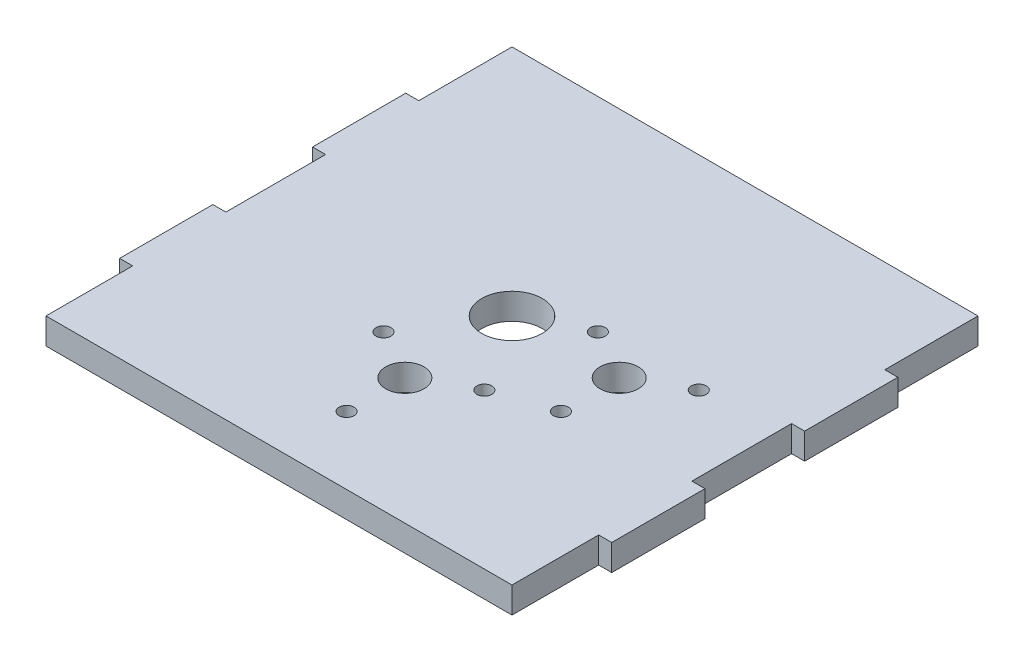
ISO-10303-21;
HEADER;
FILE_DESCRIPTION(('STEP AP214'),'2;1');
FILE_NAME('part.step','',(''),(''),'','','');
FILE_SCHEMA(('AUTOMOTIVE_DESIGN { 1 0 10303 214 1 1 1 1 }'));
ENDSEC;
DATA;
#1=APPLICATION_CONTEXT('core data for automotive mechanical design processes');
#2=APPLICATION_PROTOCOL_DEFINITION('international standard','automotive_design',2000,#1);
#3=PRODUCT_CONTEXT('',#1,'mechanical');
#4=PRODUCT('Part','Part','',(#3));
#5=PRODUCT_RELATED_PRODUCT_CATEGORY('part','',(#4));
#6=PRODUCT_DEFINITION_FORMATION('','',#4);
#7=PRODUCT_DEFINITION_CONTEXT('part definition',#1,'design');
#8=PRODUCT_DEFINITION('design','',#6,#7);
#9=PRODUCT_DEFINITION_SHAPE('','',#8);
#10=(LENGTH_UNIT() NAMED_UNIT(*) SI_UNIT(.MILLI.,.METRE.));
#11=(NAMED_UNIT(*) PLANE_ANGLE_UNIT() SI_UNIT($,.RADIAN.));
#12=(NAMED_UNIT(*) SI_UNIT($,.STERADIAN.) SOLID_ANGLE_UNIT());
#13=UNCERTAINTY_MEASURE_WITH_UNIT(LENGTH_MEASURE(1.E-05),#10,'distance_accuracy_value','');
#14=(GEOMETRIC_REPRESENTATION_CONTEXT(3) GLOBAL_UNCERTAINTY_ASSIGNED_CONTEXT((#13)) GLOBAL_UNIT_ASSIGNED_CONTEXT((#10,
#11,#12)) REPRESENTATION_CONTEXT('',''));
#15=CARTESIAN_POINT('',(0.,0.,0.));
#16=DIRECTION('',(0.,0.,1.));
#17=DIRECTION('',(1.,0.,0.));
#18=AXIS2_PLACEMENT_3D('',#15,#16,#17);
#19=CARTESIAN_POINT('',(222.2,5.59999999999876,105.6));
#20=DIRECTION('',(0.,0.,1.));
#21=DIRECTION('',(0.,-1.,0.));
#22=AXIS2_PLACEMENT_3D('',#19,#20,#21);
#23=PLANE('',#22);
#24=DIRECTION('',(-1.,0.,0.));
#25=VECTOR('',#24,1.);
#26=CARTESIAN_POINT('',(222.2,-1.23669084790829E-12,105.6));
#27=LINE('',#26,#25);
#28=CARTESIAN_POINT('',(222.2,-1.23669084790829E-12,105.6));
#29=VERTEX_POINT('',#28);
#30=CARTESIAN_POINT('',(122.2,-6.81579335595712E-13,105.6));
#31=VERTEX_POINT('',#30);
#32=EDGE_CURVE('E203',#29,#31,#27,.T.);
#33=ORIENTED_EDGE('',*,*,#32,.F.);
#34=DIRECTION('',(0.,-1.,0.));
#35=VECTOR('',#34,1.);
#36=CARTESIAN_POINT('',(222.2,5.59999999999876,105.6));
#37=LINE('',#36,#35);
#38=CARTESIAN_POINT('',(222.2,5.59999999999876,105.6));
#39=VERTEX_POINT('',#38);
#40=EDGE_CURVE('E11',#39,#29,#37,.T.);
#41=ORIENTED_EDGE('',*,*,#40,.F.);
#42=DIRECTION('',(-1.,0.,0.));
#43=VECTOR('',#42,1.);
#44=CARTESIAN_POINT('',(222.2,5.59999999999876,105.6));
#45=LINE('',#44,#43);
#46=CARTESIAN_POINT('',(122.2,5.59999999999932,105.6));
#47=VERTEX_POINT('',#46);
#48=EDGE_CURVE('E260',#39,#47,#45,.T.);
#49=ORIENTED_EDGE('',*,*,#48,.T.);
#50=DIRECTION('',(0.,-1.,0.));
#51=VECTOR('',#50,1.);
#52=CARTESIAN_POINT('',(122.2,5.59999999999932,105.6));
#53=LINE('',#52,#51);
#54=EDGE_CURVE('E37',#47,#31,#53,.T.);
#55=ORIENTED_EDGE('',*,*,#54,.T.);
#56=EDGE_LOOP('',(#33,#41,#49,#55));
#57=FACE_BOUND('',#56,.T.);
#58=ADVANCED_FACE('F34',(#57),#23,.T.);
#59=CARTESIAN_POINT('',(222.2,5.59999999999876,87.));
#60=DIRECTION('',(1.,0.,0.));
#61=DIRECTION('',(0.,1.,0.));
#62=AXIS2_PLACEMENT_3D('',#59,#60,#61);
#63=PLANE('',#62);
#64=DIRECTION('',(0.,0.,1.));
#65=VECTOR('',#64,1.);
#66=CARTESIAN_POINT('',(222.2,-1.23612138714669E-12,87.));
#67=LINE('',#66,#65);
#68=CARTESIAN_POINT('',(222.2,-1.23612138714669E-12,87.));
#69=VERTEX_POINT('',#68);
#70=EDGE_CURVE('E258',#69,#29,#67,.T.);
#71=ORIENTED_EDGE('',*,*,#70,.F.);
#72=DIRECTION('',(0.,-1.,0.));
#73=VECTOR('',#72,1.);
#74=CARTESIAN_POINT('',(222.2,5.59999999999876,87.));
#75=LINE('',#74,#73);
#76=CARTESIAN_POINT('',(222.2,5.59999999999876,87.));
#77=VERTEX_POINT('',#76);
#78=EDGE_CURVE('E43',#77,#69,#75,.T.);
#79=ORIENTED_EDGE('',*,*,#78,.F.);
#80=DIRECTION('',(0.,0.,1.));
#81=VECTOR('',#80,1.);
#82=CARTESIAN_POINT('',(222.2,5.59999999999876,87.));
#83=LINE('',#82,#81);
#84=EDGE_CURVE('E193',#77,#39,#83,.T.);
#85=ORIENTED_EDGE('',*,*,#84,.T.);
#86=ORIENTED_EDGE('',*,*,#40,.T.);
#87=EDGE_LOOP('',(#71,#79,#85,#86));
#88=FACE_BOUND('',#87,.T.);
#89=ADVANCED_FACE('F296',(#88),#63,.T.);
#90=CARTESIAN_POINT('',(225.,5.59999999999875,87.));
#91=DIRECTION('',(0.,0.,1.));
#92=DIRECTION('',(0.,-1.,0.));
#93=AXIS2_PLACEMENT_3D('',#90,#91,#92);
#94=PLANE('',#93);
#95=DIRECTION('',(-1.,0.,0.));
#96=VECTOR('',#95,1.);
#97=CARTESIAN_POINT('',(225.,-1.25166450949144E-12,87.));
#98=LINE('',#97,#96);
#99=CARTESIAN_POINT('',(225.,-1.25166450949144E-12,87.));
#100=VERTEX_POINT('',#99);
#101=EDGE_CURVE('E180',#100,#69,#98,.T.);
#102=ORIENTED_EDGE('',*,*,#101,.F.);
#103=DIRECTION('',(0.,-1.,0.));
#104=VECTOR('',#103,1.);
#105=CARTESIAN_POINT('',(225.,5.59999999999875,87.));
#106=LINE('',#105,#104);
#107=CARTESIAN_POINT('',(225.,5.59999999999875,87.));
#108=VERTEX_POINT('',#107);
#109=EDGE_CURVE('E175',#108,#100,#106,.T.);
#110=ORIENTED_EDGE('',*,*,#109,.F.);
#111=DIRECTION('',(-1.,0.,0.));
#112=VECTOR('',#111,1.);
#113=CARTESIAN_POINT('',(225.,5.59999999999875,87.));
#114=LINE('',#113,#112);
#115=EDGE_CURVE('E178',#108,#77,#114,.T.);
#116=ORIENTED_EDGE('',*,*,#115,.T.);
#117=ORIENTED_EDGE('',*,*,#78,.T.);
#118=EDGE_LOOP('',(#102,#110,#116,#117));
#119=FACE_BOUND('',#118,.T.);
#120=ADVANCED_FACE('F177',(#119),#94,.T.);
#121=CARTESIAN_POINT('',(225.,5.59999999999875,67.));
#122=DIRECTION('',(1.,0.,0.));
#123=DIRECTION('',(0.,1.,0.));
#124=AXIS2_PLACEMENT_3D('',#121,#122,#123);
#125=PLANE('',#124);
#126=DIRECTION('',(0.,0.,1.));
#127=VECTOR('',#126,1.);
#128=CARTESIAN_POINT('',(225.,-1.25105218609187E-12,67.));
#129=LINE('',#128,#127);
#130=CARTESIAN_POINT('',(225.,-1.25105218609187E-12,67.));
#131=VERTEX_POINT('',#130);
#132=EDGE_CURVE('E255',#131,#100,#129,.T.);
#133=ORIENTED_EDGE('',*,*,#132,.F.);
#134=DIRECTION('',(0.,-1.,0.));
#135=VECTOR('',#134,1.);
#136=CARTESIAN_POINT('',(225.,5.59999999999875,67.));
#137=LINE('',#136,#135);
#138=CARTESIAN_POINT('',(225.,5.59999999999875,67.));
#139=VERTEX_POINT('',#138);
#140=EDGE_CURVE('E185',#139,#131,#137,.T.);
#141=ORIENTED_EDGE('',*,*,#140,.F.);
#142=DIRECTION('',(0.,0.,1.));
#143=VECTOR('',#142,1.);
#144=CARTESIAN_POINT('',(225.,5.59999999999875,67.));
#145=LINE('',#144,#143);
#146=EDGE_CURVE('E191',#139,#108,#145,.T.);
#147=ORIENTED_EDGE('',*,*,#146,.T.);
#148=ORIENTED_EDGE('',*,*,#109,.T.);
#149=EDGE_LOOP('',(#133,#141,#147,#148));
#150=FACE_BOUND('',#149,.T.);
#151=ADVANCED_FACE('F195',(#150),#125,.T.);
#152=CARTESIAN_POINT('',(222.2,5.59999999999877,67.));
#153=DIRECTION('',(0.,0.,-1.));
#154=DIRECTION('',(0.,1.,0.));
#155=AXIS2_PLACEMENT_3D('',#152,#153,#154);
#156=PLANE('',#155);
#157=DIRECTION('',(1.,0.,0.));
#158=VECTOR('',#157,1.);
#159=CARTESIAN_POINT('',(222.2,-1.23550906374712E-12,67.));
#160=LINE('',#159,#158);
#161=CARTESIAN_POINT('',(222.2,-1.23550906374712E-12,67.));
#162=VERTEX_POINT('',#161);
#163=EDGE_CURVE('E252',#162,#131,#160,.T.);
#164=ORIENTED_EDGE('',*,*,#163,.F.);
#165=DIRECTION('',(0.,-1.,0.));
#166=VECTOR('',#165,1.);
#167=CARTESIAN_POINT('',(222.2,5.59999999999877,67.));
#168=LINE('',#167,#166);
#169=CARTESIAN_POINT('',(222.2,5.59999999999877,67.));
#170=VERTEX_POINT('',#169);
#171=EDGE_CURVE('E264',#170,#162,#168,.T.);
#172=ORIENTED_EDGE('',*,*,#171,.F.);
#173=DIRECTION('',(1.,0.,0.));
#174=VECTOR('',#173,1.);
#175=CARTESIAN_POINT('',(222.2,5.59999999999877,67.));
#176=LINE('',#175,#174);
#177=EDGE_CURVE('E196',#170,#139,#176,.T.);
#178=ORIENTED_EDGE('',*,*,#177,.T.);
#179=ORIENTED_EDGE('',*,*,#140,.T.);
#180=EDGE_LOOP('',(#164,#172,#178,#179));
#181=FACE_BOUND('',#180,.T.);
#182=ADVANCED_FACE('F309',(#181),#156,.T.);
#183=CARTESIAN_POINT('',(222.2,5.59999999999877,45.6));
#184=DIRECTION('',(1.,0.,0.));
#185=DIRECTION('',(0.,1.,0.));
#186=AXIS2_PLACEMENT_3D('',#183,#184,#185);
#187=PLANE('',#186);
#188=DIRECTION('',(0.,0.,1.));
#189=VECTOR('',#188,1.);
#190=CARTESIAN_POINT('',(222.2,-1.23485387770957E-12,45.6));
#191=LINE('',#190,#189);
#192=CARTESIAN_POINT('',(222.2,-1.23485387770957E-12,45.6));
#193=VERTEX_POINT('',#192);
#194=EDGE_CURVE('E249',#193,#162,#191,.T.);
#195=ORIENTED_EDGE('',*,*,#194,.F.);
#196=DIRECTION('',(0.,-1.,0.));
#197=VECTOR('',#196,1.);
#198=CARTESIAN_POINT('',(222.2,5.59999999999877,45.6));
#199=LINE('',#198,#197);
#200=CARTESIAN_POINT('',(222.2,5.59999999999877,45.6));
#201=VERTEX_POINT('',#200);
#202=EDGE_CURVE('E266',#201,#193,#199,.T.);
#203=ORIENTED_EDGE('',*,*,#202,.F.);
#204=DIRECTION('',(0.,0.,1.));
#205=VECTOR('',#204,1.);
#206=CARTESIAN_POINT('',(222.2,5.59999999999877,45.6));
#207=LINE('',#206,#205);
#208=EDGE_CURVE('E198',#201,#170,#207,.T.);
#209=ORIENTED_EDGE('',*,*,#208,.T.);
#210=ORIENTED_EDGE('',*,*,#171,.T.);
#211=EDGE_LOOP('',(#195,#203,#209,#210));
#212=FACE_BOUND('',#211,.T.);
#213=ADVANCED_FACE('F312',(#212),#187,.T.);
#214=CARTESIAN_POINT('',(225.,5.59999999999875,45.6));
#215=DIRECTION('',(0.,0.,1.));
#216=DIRECTION('',(0.,-1.,0.));
#217=AXIS2_PLACEMENT_3D('',#214,#215,#216);
#218=PLANE('',#217);
#219=DIRECTION('',(-1.,0.,0.));
#220=VECTOR('',#219,1.);
#221=CARTESIAN_POINT('',(225.,-1.25039700005433E-12,45.6));
#222=LINE('',#221,#220);
#223=CARTESIAN_POINT('',(225.,-1.25039700005433E-12,45.6));
#224=VERTEX_POINT('',#223);
#225=EDGE_CURVE('E246',#224,#193,#222,.T.);
#226=ORIENTED_EDGE('',*,*,#225,.F.);
#227=DIRECTION('',(0.,-1.,0.));
#228=VECTOR('',#227,1.);
#229=CARTESIAN_POINT('',(225.,5.59999999999875,45.6));
#230=LINE('',#229,#228);
#231=CARTESIAN_POINT('',(225.,5.59999999999875,45.6));
#232=VERTEX_POINT('',#231);
#233=EDGE_CURVE('E268',#232,#224,#230,.T.);
#234=ORIENTED_EDGE('',*,*,#233,.F.);
#235=DIRECTION('',(-1.,0.,0.));
#236=VECTOR('',#235,1.);
#237=CARTESIAN_POINT('',(225.,5.59999999999875,45.6));
#238=LINE('',#237,#236);
#239=EDGE_CURVE('E512',#232,#201,#238,.T.);
#240=ORIENTED_EDGE('',*,*,#239,.T.);
#241=ORIENTED_EDGE('',*,*,#202,.T.);
#242=EDGE_LOOP('',(#226,#234,#240,#241));
#243=FACE_BOUND('',#242,.T.);
#244=ADVANCED_FACE('F316',(#243),#218,.T.);
#245=CARTESIAN_POINT('',(225.,5.59999999999875,25.6));
#246=DIRECTION('',(1.,0.,0.));
#247=DIRECTION('',(0.,1.,0.));
#248=AXIS2_PLACEMENT_3D('',#245,#246,#247);
#249=PLANE('',#248);
#250=DIRECTION('',(0.,0.,1.));
#251=VECTOR('',#250,1.);
#252=CARTESIAN_POINT('',(225.,-1.24978467665475E-12,25.6));
#253=LINE('',#252,#251);
#254=CARTESIAN_POINT('',(225.,-1.24978467665475E-12,25.6));
#255=VERTEX_POINT('',#254);
#256=EDGE_CURVE('E243',#255,#224,#253,.T.);
#257=ORIENTED_EDGE('',*,*,#256,.F.);
#258=DIRECTION('',(0.,-1.,0.));
#259=VECTOR('',#258,1.);
#260=CARTESIAN_POINT('',(225.,5.59999999999875,25.6));
#261=LINE('',#260,#259);
#262=CARTESIAN_POINT('',(225.,5.59999999999875,25.6));
#263=VERTEX_POINT('',#262);
#264=EDGE_CURVE('E270',#263,#255,#261,.T.);
#265=ORIENTED_EDGE('',*,*,#264,.F.);
#266=DIRECTION('',(0.,0.,1.));
#267=VECTOR('',#266,1.);
#268=CARTESIAN_POINT('',(225.,5.59999999999875,25.6));
#269=LINE('',#268,#267);
#270=EDGE_CURVE('E509',#263,#232,#269,.T.);
#271=ORIENTED_EDGE('',*,*,#270,.T.);
#272=ORIENTED_EDGE('',*,*,#233,.T.);
#273=EDGE_LOOP('',(#257,#265,#271,#272));
#274=FACE_BOUND('',#273,.T.);
#275=ADVANCED_FACE('F320',(#274),#249,.T.);
#276=CARTESIAN_POINT('',(222.2,5.59999999999877,25.6));
#277=DIRECTION('',(0.,0.,-1.));
#278=DIRECTION('',(0.,1.,0.));
#279=AXIS2_PLACEMENT_3D('',#276,#277,#278);
#280=PLANE('',#279);
#281=DIRECTION('',(1.,0.,0.));
#282=VECTOR('',#281,1.);
#283=CARTESIAN_POINT('',(222.2,-1.23424155431E-12,25.6));
#284=LINE('',#283,#282);
#285=CARTESIAN_POINT('',(222.2,-1.23424155431E-12,25.6));
#286=VERTEX_POINT('',#285);
#287=EDGE_CURVE('E240',#286,#255,#284,.T.);
#288=ORIENTED_EDGE('',*,*,#287,.F.);
#289=DIRECTION('',(0.,-1.,0.));
#290=VECTOR('',#289,1.);
#291=CARTESIAN_POINT('',(222.2,5.59999999999877,25.6));
#292=LINE('',#291,#290);
#293=CARTESIAN_POINT('',(222.2,5.59999999999877,25.6));
#294=VERTEX_POINT('',#293);
#295=EDGE_CURVE('E272',#294,#286,#292,.T.);
#296=ORIENTED_EDGE('',*,*,#295,.F.);
#297=DIRECTION('',(1.,0.,0.));
#298=VECTOR('',#297,1.);
#299=CARTESIAN_POINT('',(222.2,5.59999999999877,25.6));
#300=LINE('',#299,#298);
#301=EDGE_CURVE('E506',#294,#263,#300,.T.);
#302=ORIENTED_EDGE('',*,*,#301,.T.);
#303=ORIENTED_EDGE('',*,*,#264,.T.);
#304=EDGE_LOOP('',(#288,#296,#302,#303));
#305=FACE_BOUND('',#304,.T.);
#306=ADVANCED_FACE('F324',(#305),#280,.T.);
#307=CARTESIAN_POINT('',(222.2,5.59999999999877,5.59999999999998));
#308=DIRECTION('',(1.,0.,0.));
#309=DIRECTION('',(0.,1.,0.));
#310=AXIS2_PLACEMENT_3D('',#307,#308,#309);
#311=PLANE('',#310);
#312=DIRECTION('',(0.,0.,1.));
#313=VECTOR('',#312,1.);
#314=CARTESIAN_POINT('',(222.2,-1.23362923091043E-12,5.59999999999998));
#315=LINE('',#314,#313);
#316=CARTESIAN_POINT('',(222.2,-1.23362923091043E-12,5.59999999999998));
#317=VERTEX_POINT('',#316);
#318=EDGE_CURVE('E237',#317,#286,#315,.T.);
#319=ORIENTED_EDGE('',*,*,#318,.F.);
#320=DIRECTION('',(0.,-1.,0.));
#321=VECTOR('',#320,1.);
#322=CARTESIAN_POINT('',(222.2,5.59999999999877,5.59999999999998));
#323=LINE('',#322,#321);
#324=CARTESIAN_POINT('',(222.2,5.59999999999877,5.59999999999998));
#325=VERTEX_POINT('',#324);
#326=EDGE_CURVE('E274',#325,#317,#323,.T.);
#327=ORIENTED_EDGE('',*,*,#326,.F.);
#328=DIRECTION('',(0.,0.,1.));
#329=VECTOR('',#328,1.);
#330=CARTESIAN_POINT('',(222.2,5.59999999999877,5.59999999999998));
#331=LINE('',#330,#329);
#332=EDGE_CURVE('E503',#325,#294,#331,.T.);
#333=ORIENTED_EDGE('',*,*,#332,.T.);
#334=ORIENTED_EDGE('',*,*,#295,.T.);
#335=EDGE_LOOP('',(#319,#327,#333,#334));
#336=FACE_BOUND('',#335,.T.);
#337=ADVANCED_FACE('F328',(#336),#311,.T.);
#338=CARTESIAN_POINT('',(122.2,5.59999999999932,5.59999999999998));
#339=DIRECTION('',(0.,0.,-1.));
#340=DIRECTION('',(0.,1.,0.));
#341=AXIS2_PLACEMENT_3D('',#338,#339,#340);
#342=PLANE('',#341);
#343=DIRECTION('',(1.,0.,0.));
#344=VECTOR('',#343,1.);
#345=CARTESIAN_POINT('',(122.2,-6.78517718597851E-13,5.59999999999998));
#346=LINE('',#345,#344);
#347=CARTESIAN_POINT('',(122.2,-6.78517718597851E-13,5.59999999999998));
#348=VERTEX_POINT('',#347);
#349=EDGE_CURVE('E234',#348,#317,#346,.T.);
#350=ORIENTED_EDGE('',*,*,#349,.F.);
#351=DIRECTION('',(0.,-1.,0.));
#352=VECTOR('',#351,1.);
#353=CARTESIAN_POINT('',(122.2,5.59999999999932,5.59999999999998));
#354=LINE('',#353,#352);
#355=CARTESIAN_POINT('',(122.2,5.59999999999932,5.59999999999998));
#356=VERTEX_POINT('',#355);
#357=EDGE_CURVE('E276',#356,#348,#354,.T.);
#358=ORIENTED_EDGE('',*,*,#357,.F.);
#359=DIRECTION('',(1.,0.,0.));
#360=VECTOR('',#359,1.);
#361=CARTESIAN_POINT('',(122.2,5.59999999999932,5.59999999999998));
#362=LINE('',#361,#360);
#363=EDGE_CURVE('E500',#356,#325,#362,.T.);
#364=ORIENTED_EDGE('',*,*,#363,.T.);
#365=ORIENTED_EDGE('',*,*,#326,.T.);
#366=EDGE_LOOP('',(#350,#358,#364,#365));
#367=FACE_BOUND('',#366,.T.);
#368=ADVANCED_FACE('F332',(#367),#342,.T.);
#369=CARTESIAN_POINT('',(122.2,5.59999999999932,25.6));
#370=DIRECTION('',(-1.,0.,0.));
#371=DIRECTION('',(0.,-1.,0.));
#372=AXIS2_PLACEMENT_3D('',#369,#370,#371);
#373=PLANE('',#372);
#374=DIRECTION('',(0.,0.,-1.));
#375=VECTOR('',#374,1.);
#376=CARTESIAN_POINT('',(122.2,-6.79130041997424E-13,25.6));
#377=LINE('',#376,#375);
#378=CARTESIAN_POINT('',(122.2,-6.79130041997424E-13,25.6));
#379=VERTEX_POINT('',#378);
#380=EDGE_CURVE('E231',#379,#348,#377,.T.);
#381=ORIENTED_EDGE('',*,*,#380,.F.);
#382=DIRECTION('',(0.,-1.,0.));
#383=VECTOR('',#382,1.);
#384=CARTESIAN_POINT('',(122.2,5.59999999999932,25.6));
#385=LINE('',#384,#383);
#386=CARTESIAN_POINT('',(122.2,5.59999999999932,25.6));
#387=VERTEX_POINT('',#386);
#388=EDGE_CURVE('E278',#387,#379,#385,.T.);
#389=ORIENTED_EDGE('',*,*,#388,.F.);
#390=DIRECTION('',(0.,0.,-1.));
#391=VECTOR('',#390,1.);
#392=CARTESIAN_POINT('',(122.2,5.59999999999932,25.6));
#393=LINE('',#392,#391);
#394=EDGE_CURVE('E497',#387,#356,#393,.T.);
#395=ORIENTED_EDGE('',*,*,#394,.T.);
#396=ORIENTED_EDGE('',*,*,#357,.T.);
#397=EDGE_LOOP('',(#381,#389,#395,#396));
#398=FACE_BOUND('',#397,.T.);
#399=ADVANCED_FACE('F336',(#398),#373,.T.);
#400=CARTESIAN_POINT('',(119.4,5.59999999999934,25.6));
#401=DIRECTION('',(0.,0.,-1.));
#402=DIRECTION('',(0.,1.,0.));
#403=AXIS2_PLACEMENT_3D('',#400,#401,#402);
#404=PLANE('',#403);
#405=DIRECTION('',(1.,0.,0.));
#406=VECTOR('',#405,1.);
#407=CARTESIAN_POINT('',(119.4,-6.63586919652671E-13,25.6));
#408=LINE('',#407,#406);
#409=CARTESIAN_POINT('',(119.4,-6.63586919652671E-13,25.6));
#410=VERTEX_POINT('',#409);
#411=EDGE_CURVE('E228',#410,#379,#408,.T.);
#412=ORIENTED_EDGE('',*,*,#411,.F.);
#413=DIRECTION('',(0.,-1.,0.));
#414=VECTOR('',#413,1.);
#415=CARTESIAN_POINT('',(119.4,5.59999999999934,25.6));
#416=LINE('',#415,#414);
#417=CARTESIAN_POINT('',(119.4,5.59999999999934,25.6));
#418=VERTEX_POINT('',#417);
#419=EDGE_CURVE('E280',#418,#410,#416,.T.);
#420=ORIENTED_EDGE('',*,*,#419,.F.);
#421=DIRECTION('',(1.,0.,0.));
#422=VECTOR('',#421,1.);
#423=CARTESIAN_POINT('',(119.4,5.59999999999934,25.6));
#424=LINE('',#423,#422);
#425=EDGE_CURVE('E494',#418,#387,#424,.T.);
#426=ORIENTED_EDGE('',*,*,#425,.T.);
#427=ORIENTED_EDGE('',*,*,#388,.T.);
#428=EDGE_LOOP('',(#412,#420,#426,#427));
#429=FACE_BOUND('',#428,.T.);
#430=ADVANCED_FACE('F340',(#429),#404,.T.);
#431=CARTESIAN_POINT('',(119.4,5.59999999999934,45.6));
#432=DIRECTION('',(-1.,0.,0.));
#433=DIRECTION('',(0.,-1.,0.));
#434=AXIS2_PLACEMENT_3D('',#431,#432,#433);
#435=PLANE('',#434);
#436=DIRECTION('',(0.,0.,-1.));
#437=VECTOR('',#436,1.);
#438=CARTESIAN_POINT('',(119.4,-6.64199243052244E-13,45.6));
#439=LINE('',#438,#437);
#440=CARTESIAN_POINT('',(119.4,-6.64199243052244E-13,45.6));
#441=VERTEX_POINT('',#440);
#442=EDGE_CURVE('E225',#441,#410,#439,.T.);
#443=ORIENTED_EDGE('',*,*,#442,.F.);
#444=DIRECTION('',(0.,-1.,0.));
#445=VECTOR('',#444,1.);
#446=CARTESIAN_POINT('',(119.4,5.59999999999934,45.6));
#447=LINE('',#446,#445);
#448=CARTESIAN_POINT('',(119.4,5.59999999999934,45.6));
#449=VERTEX_POINT('',#448);
#450=EDGE_CURVE('E282',#449,#441,#447,.T.);
#451=ORIENTED_EDGE('',*,*,#450,.F.);
#452=DIRECTION('',(0.,0.,-1.));
#453=VECTOR('',#452,1.);
#454=CARTESIAN_POINT('',(119.4,5.59999999999934,45.6));
#455=LINE('',#454,#453);
#456=EDGE_CURVE('E491',#449,#418,#455,.T.);
#457=ORIENTED_EDGE('',*,*,#456,.T.);
#458=ORIENTED_EDGE('',*,*,#419,.T.);
#459=EDGE_LOOP('',(#443,#451,#457,#458));
#460=FACE_BOUND('',#459,.T.);
#461=ADVANCED_FACE('F344',(#460),#435,.T.);
#462=CARTESIAN_POINT('',(122.2,5.59999999999932,45.6));
#463=DIRECTION('',(0.,0.,1.));
#464=DIRECTION('',(0.,-1.,0.));
#465=AXIS2_PLACEMENT_3D('',#462,#463,#464);
#466=PLANE('',#465);
#467=DIRECTION('',(-1.,0.,0.));
#468=VECTOR('',#467,1.);
#469=CARTESIAN_POINT('',(122.2,-6.79742365396996E-13,45.6));
#470=LINE('',#469,#468);
#471=CARTESIAN_POINT('',(122.2,-6.79742365396996E-13,45.6));
#472=VERTEX_POINT('',#471);
#473=EDGE_CURVE('E222',#472,#441,#470,.T.);
#474=ORIENTED_EDGE('',*,*,#473,.F.);
#475=DIRECTION('',(0.,-1.,0.));
#476=VECTOR('',#475,1.);
#477=CARTESIAN_POINT('',(122.2,5.59999999999932,45.6));
#478=LINE('',#477,#476);
#479=CARTESIAN_POINT('',(122.2,5.59999999999932,45.6));
#480=VERTEX_POINT('',#479);
#481=EDGE_CURVE('E284',#480,#472,#478,.T.);
#482=ORIENTED_EDGE('',*,*,#481,.F.);
#483=DIRECTION('',(-1.,0.,0.));
#484=VECTOR('',#483,1.);
#485=CARTESIAN_POINT('',(122.2,5.59999999999932,45.6));
#486=LINE('',#485,#484);
#487=EDGE_CURVE('E488',#480,#449,#486,.T.);
#488=ORIENTED_EDGE('',*,*,#487,.T.);
#489=ORIENTED_EDGE('',*,*,#450,.T.);
#490=EDGE_LOOP('',(#474,#482,#488,#489));
#491=FACE_BOUND('',#490,.T.);
#492=ADVANCED_FACE('F348',(#491),#466,.T.);
#493=CARTESIAN_POINT('',(122.2,5.59999999999932,67.));
#494=DIRECTION('',(-1.,0.,0.));
#495=DIRECTION('',(0.,-1.,0.));
#496=AXIS2_PLACEMENT_3D('',#493,#494,#495);
#497=PLANE('',#496);
#498=DIRECTION('',(0.,0.,-1.));
#499=VECTOR('',#498,1.);
#500=CARTESIAN_POINT('',(122.2,-6.80397551434538E-13,67.));
#501=LINE('',#500,#499);
#502=CARTESIAN_POINT('',(122.2,-6.80397551434538E-13,67.));
#503=VERTEX_POINT('',#502);
#504=EDGE_CURVE('E219',#503,#472,#501,.T.);
#505=ORIENTED_EDGE('',*,*,#504,.F.);
#506=DIRECTION('',(0.,-1.,0.));
#507=VECTOR('',#506,1.);
#508=CARTESIAN_POINT('',(122.2,5.59999999999932,67.));
#509=LINE('',#508,#507);
#510=CARTESIAN_POINT('',(122.2,5.59999999999932,67.));
#511=VERTEX_POINT('',#510);
#512=EDGE_CURVE('E286',#511,#503,#509,.T.);
#513=ORIENTED_EDGE('',*,*,#512,.F.);
#514=DIRECTION('',(0.,0.,-1.));
#515=VECTOR('',#514,1.);
#516=CARTESIAN_POINT('',(122.2,5.59999999999932,67.));
#517=LINE('',#516,#515);
#518=EDGE_CURVE('E485',#511,#480,#517,.T.);
#519=ORIENTED_EDGE('',*,*,#518,.T.);
#520=ORIENTED_EDGE('',*,*,#481,.T.);
#521=EDGE_LOOP('',(#505,#513,#519,#520));
#522=FACE_BOUND('',#521,.T.);
#523=ADVANCED_FACE('F352',(#522),#497,.T.);
#524=CARTESIAN_POINT('',(119.4,5.59999999999933,67.));
#525=DIRECTION('',(0.,0.,-1.));
#526=DIRECTION('',(-1.,0.,0.));
#527=AXIS2_PLACEMENT_3D('',#524,#525,#526);
#528=PLANE('',#527);
#529=DIRECTION('',(1.,0.,0.));
#530=VECTOR('',#529,1.);
#531=CARTESIAN_POINT('',(119.4,-6.64854429089785E-13,67.));
#532=LINE('',#531,#530);
#533=CARTESIAN_POINT('',(119.4,-6.64854429089785E-13,67.));
#534=VERTEX_POINT('',#533);
#535=EDGE_CURVE('E216',#534,#503,#532,.T.);
#536=ORIENTED_EDGE('',*,*,#535,.F.);
#537=DIRECTION('',(0.,-1.,0.));
#538=VECTOR('',#537,1.);
#539=CARTESIAN_POINT('',(119.4,5.59999999999933,67.));
#540=LINE('',#539,#538);
#541=CARTESIAN_POINT('',(119.4,5.59999999999933,67.));
#542=VERTEX_POINT('',#541);
#543=EDGE_CURVE('E288',#542,#534,#540,.T.);
#544=ORIENTED_EDGE('',*,*,#543,.F.);
#545=DIRECTION('',(1.,0.,0.));
#546=VECTOR('',#545,1.);
#547=CARTESIAN_POINT('',(119.4,5.59999999999933,67.));
#548=LINE('',#547,#546);
#549=EDGE_CURVE('E482',#542,#511,#548,.T.);
#550=ORIENTED_EDGE('',*,*,#549,.T.);
#551=ORIENTED_EDGE('',*,*,#512,.T.);
#552=EDGE_LOOP('',(#536,#544,#550,#551));
#553=FACE_BOUND('',#552,.T.);
#554=ADVANCED_FACE('F356',(#553),#528,.T.);
#555=CARTESIAN_POINT('',(119.4,5.59999999999933,87.));
#556=DIRECTION('',(-1.,0.,0.));
#557=DIRECTION('',(0.,-1.,0.));
#558=AXIS2_PLACEMENT_3D('',#555,#556,#557);
#559=PLANE('',#558);
#560=DIRECTION('',(0.,0.,-1.));
#561=VECTOR('',#560,1.);
#562=CARTESIAN_POINT('',(119.4,-6.65466752489357E-13,87.));
#563=LINE('',#562,#561);
#564=CARTESIAN_POINT('',(119.4,-6.65466752489357E-13,87.));
#565=VERTEX_POINT('',#564);
#566=EDGE_CURVE('E213',#565,#534,#563,.T.);
#567=ORIENTED_EDGE('',*,*,#566,.F.);
#568=DIRECTION('',(0.,-1.,0.));
#569=VECTOR('',#568,1.);
#570=CARTESIAN_POINT('',(119.4,5.59999999999933,87.));
#571=LINE('',#570,#569);
#572=CARTESIAN_POINT('',(119.4,5.59999999999933,87.));
#573=VERTEX_POINT('',#572);
#574=EDGE_CURVE('E290',#573,#565,#571,.T.);
#575=ORIENTED_EDGE('',*,*,#574,.F.);
#576=DIRECTION('',(0.,0.,-1.));
#577=VECTOR('',#576,1.);
#578=CARTESIAN_POINT('',(119.4,5.59999999999933,87.));
#579=LINE('',#578,#577);
#580=EDGE_CURVE('E479',#573,#542,#579,.T.);
#581=ORIENTED_EDGE('',*,*,#580,.T.);
#582=ORIENTED_EDGE('',*,*,#543,.T.);
#583=EDGE_LOOP('',(#567,#575,#581,#582));
#584=FACE_BOUND('',#583,.T.);
#585=ADVANCED_FACE('F360',(#584),#559,.T.);
#586=CARTESIAN_POINT('',(122.2,5.59999999999932,87.));
#587=DIRECTION('',(0.,0.,1.));
#588=DIRECTION('',(1.,0.,0.));
#589=AXIS2_PLACEMENT_3D('',#586,#587,#588);
#590=PLANE('',#589);
#591=DIRECTION('',(-1.,0.,0.));
#592=VECTOR('',#591,1.);
#593=CARTESIAN_POINT('',(122.2,-6.8100987483411E-13,87.));
#594=LINE('',#593,#592);
#595=CARTESIAN_POINT('',(122.2,-6.8100987483411E-13,87.));
#596=VERTEX_POINT('',#595);
#597=EDGE_CURVE('E210',#596,#565,#594,.T.);
#598=ORIENTED_EDGE('',*,*,#597,.F.);
#599=DIRECTION('',(0.,-1.,0.));
#600=VECTOR('',#599,1.);
#601=CARTESIAN_POINT('',(122.2,5.59999999999932,87.));
#602=LINE('',#601,#600);
#603=CARTESIAN_POINT('',(122.2,5.59999999999932,87.));
#604=VERTEX_POINT('',#603);
#605=EDGE_CURVE('E291',#604,#596,#602,.T.);
#606=ORIENTED_EDGE('',*,*,#605,.F.);
#607=DIRECTION('',(-1.,0.,0.));
#608=VECTOR('',#607,1.);
#609=CARTESIAN_POINT('',(122.2,5.59999999999932,87.));
#610=LINE('',#609,#608);
#611=EDGE_CURVE('E476',#604,#573,#610,.T.);
#612=ORIENTED_EDGE('',*,*,#611,.T.);
#613=ORIENTED_EDGE('',*,*,#574,.T.);
#614=EDGE_LOOP('',(#598,#606,#612,#613));
#615=FACE_BOUND('',#614,.T.);
#616=ADVANCED_FACE('F364',(#615),#590,.T.);
#617=CARTESIAN_POINT('',(122.2,5.59999999999932,105.6));
#618=DIRECTION('',(-1.,0.,0.));
#619=DIRECTION('',(0.,-1.,0.));
#620=AXIS2_PLACEMENT_3D('',#617,#618,#619);
#621=PLANE('',#620);
#622=DIRECTION('',(0.,0.,-1.));
#623=VECTOR('',#622,1.);
#624=CARTESIAN_POINT('',(122.2,-6.81579335595712E-13,105.6));
#625=LINE('',#624,#623);
#626=EDGE_CURVE('E206',#31,#596,#625,.T.);
#627=ORIENTED_EDGE('',*,*,#626,.F.);
#628=ORIENTED_EDGE('',*,*,#54,.F.);
#629=DIRECTION('',(0.,0.,-1.));
#630=VECTOR('',#629,1.);
#631=CARTESIAN_POINT('',(122.2,5.59999999999932,105.6));
#632=LINE('',#631,#630);
#633=EDGE_CURVE('E474',#47,#604,#632,.T.);
#634=ORIENTED_EDGE('',*,*,#633,.T.);
#635=ORIENTED_EDGE('',*,*,#605,.T.);
#636=EDGE_LOOP('',(#627,#628,#634,#635));
#637=FACE_BOUND('',#636,.T.);
#638=ADVANCED_FACE('F293',(#637),#621,.T.);
#639=CARTESIAN_POINT('',(0.,5.6,0.));
#640=DIRECTION('',(0.,-1.,0.));
#641=DIRECTION('',(1.,0.,0.));
#642=AXIS2_PLACEMENT_3D('',#639,#640,#641);
#643=PLANE('',#642);
#644=CARTESIAN_POINT('',(172.2,5.59999999999905,55.6000000000001));
#645=DIRECTION('',(0.,-1.,0.));
#646=DIRECTION('',(1.,0.,0.));
#647=AXIS2_PLACEMENT_3D('',#644,#645,#646);
#648=CIRCLE('',#647,6.50000000000002);
#649=CARTESIAN_POINT('',(178.7,5.59999999999901,55.6000000000001));
#650=VERTEX_POINT('',#649);
#651=EDGE_CURVE('E422',#650,#650,#648,.F.);
#652=ORIENTED_EDGE('',*,*,#651,.F.);
#653=EDGE_LOOP('',(#652));
#654=FACE_BOUND('',#653,.T.);
#655=CARTESIAN_POINT('',(184.374682452695,5.59999999999897,49.3499999999999));
#656=DIRECTION('',(0.,-1.,0.));
#657=DIRECTION('',(1.,0.,0.));
#658=AXIS2_PLACEMENT_3D('',#655,#656,#657);
#659=CIRCLE('',#658,1.60000000000007);
#660=CARTESIAN_POINT('',(185.974682452695,5.59999999999896,49.3499999999999));
#661=VERTEX_POINT('',#660);
#662=EDGE_CURVE('E426',#661,#661,#659,.F.);
#663=ORIENTED_EDGE('',*,*,#662,.F.);
#664=EDGE_LOOP('',(#663));
#665=FACE_BOUND('',#664,.T.);
#666=CARTESIAN_POINT('',(161.374682452695,5.59999999999911,72.3499999999998));
#667=DIRECTION('',(0.,-1.,0.));
#668=DIRECTION('',(1.,0.,0.));
#669=AXIS2_PLACEMENT_3D('',#666,#667,#668);
#670=CIRCLE('',#669,1.60000000000015);
#671=CARTESIAN_POINT('',(162.974682452695,5.5999999999991,72.3499999999998));
#672=VERTEX_POINT('',#671);
#673=EDGE_CURVE('E435',#672,#672,#670,.F.);
#674=ORIENTED_EDGE('',*,*,#673,.F.);
#675=EDGE_LOOP('',(#674));
#676=FACE_BOUND('',#675,.T.);
#677=CARTESIAN_POINT('',(183.025317547306,5.59999999999897,72.3500000000004));
#678=DIRECTION('',(0.,-1.,0.));
#679=DIRECTION('',(1.,0.,0.));
#680=AXIS2_PLACEMENT_3D('',#677,#678,#679);
#681=CIRCLE('',#680,1.59999999999984);
#682=CARTESIAN_POINT('',(184.625317547306,5.59999999999896,72.3500000000004));
#683=VERTEX_POINT('',#682);
#684=EDGE_CURVE('E441',#683,#683,#681,.F.);
#685=ORIENTED_EDGE('',*,*,#684,.F.);
#686=EDGE_LOOP('',(#685));
#687=FACE_BOUND('',#686,.T.);
#688=CARTESIAN_POINT('',(206.025317547306,5.59999999999886,49.3500000000004));
#689=DIRECTION('',(0.,-1.,0.));
#690=DIRECTION('',(1.,0.,0.));
#691=AXIS2_PLACEMENT_3D('',#688,#689,#690);
#692=CIRCLE('',#691,1.59999999999974);
#693=CARTESIAN_POINT('',(207.625317547306,5.59999999999885,49.3500000000004));
#694=VERTEX_POINT('',#693);
#695=EDGE_CURVE('E447',#694,#694,#692,.F.);
#696=ORIENTED_EDGE('',*,*,#695,.F.);
#697=EDGE_LOOP('',(#696));
#698=FACE_BOUND('',#697,.T.);
#699=CARTESIAN_POINT('',(172.2,5.59999999999905,91.1000000000001));
#700=DIRECTION('',(0.,-1.,0.));
#701=DIRECTION('',(1.,0.,0.));
#702=AXIS2_PLACEMENT_3D('',#699,#700,#701);
#703=CIRCLE('',#702,1.60000000000013);
#704=CARTESIAN_POINT('',(173.8,5.59999999999904,91.1000000000001));
#705=VERTEX_POINT('',#704);
#706=EDGE_CURVE('E453',#705,#705,#703,.F.);
#707=ORIENTED_EDGE('',*,*,#706,.F.);
#708=EDGE_LOOP('',(#707));
#709=FACE_BOUND('',#708,.T.);
#710=CARTESIAN_POINT('',(195.2,5.59999999999891,68.1000000000001));
#711=DIRECTION('',(0.,-1.,0.));
#712=DIRECTION('',(1.,0.,0.));
#713=AXIS2_PLACEMENT_3D('',#710,#711,#712);
#714=CIRCLE('',#713,1.59999999999999);
#715=CARTESIAN_POINT('',(196.8,5.5999999999989,68.1000000000001));
#716=VERTEX_POINT('',#715);
#717=EDGE_CURVE('E459',#716,#716,#714,.F.);
#718=ORIENTED_EDGE('',*,*,#717,.F.);
#719=EDGE_LOOP('',(#718));
#720=FACE_BOUND('',#719,.T.);
#721=CARTESIAN_POINT('',(195.2,5.59999999999891,55.6000000000001));
#722=DIRECTION('',(0.,-1.,0.));
#723=DIRECTION('',(1.,0.,0.));
#724=AXIS2_PLACEMENT_3D('',#721,#722,#723);
#725=CIRCLE('',#724,4.09999999999999);
#726=CARTESIAN_POINT('',(199.3,5.59999999999889,55.6000000000001));
#727=VERTEX_POINT('',#726);
#728=EDGE_CURVE('E465',#727,#727,#725,.F.);
#729=ORIENTED_EDGE('',*,*,#728,.F.);
#730=EDGE_LOOP('',(#729));
#731=FACE_BOUND('',#730,.T.);
#732=CARTESIAN_POINT('',(172.2,5.59999999999905,78.6000000000001));
#733=DIRECTION('',(0.,-1.,0.));
#734=DIRECTION('',(1.,0.,0.));
#735=AXIS2_PLACEMENT_3D('',#732,#733,#734);
#736=CIRCLE('',#735,4.09999999999998);
#737=CARTESIAN_POINT('',(176.3,5.59999999999903,78.6000000000001));
#738=VERTEX_POINT('',#737);
#739=EDGE_CURVE('E207',#738,#738,#736,.F.);
#740=ORIENTED_EDGE('',*,*,#739,.F.);
#741=EDGE_LOOP('',(#740));
#742=FACE_BOUND('',#741,.T.);
#743=ORIENTED_EDGE('',*,*,#48,.F.);
#744=ORIENTED_EDGE('',*,*,#84,.F.);
#745=ORIENTED_EDGE('',*,*,#115,.F.);
#746=ORIENTED_EDGE('',*,*,#146,.F.);
#747=ORIENTED_EDGE('',*,*,#177,.F.);
#748=ORIENTED_EDGE('',*,*,#208,.F.);
#749=ORIENTED_EDGE('',*,*,#239,.F.);
#750=ORIENTED_EDGE('',*,*,#270,.F.);
#751=ORIENTED_EDGE('',*,*,#301,.F.);
#752=ORIENTED_EDGE('',*,*,#332,.F.);
#753=ORIENTED_EDGE('',*,*,#363,.F.);
#754=ORIENTED_EDGE('',*,*,#394,.F.);
#755=ORIENTED_EDGE('',*,*,#425,.F.);
#756=ORIENTED_EDGE('',*,*,#456,.F.);
#757=ORIENTED_EDGE('',*,*,#487,.F.);
#758=ORIENTED_EDGE('',*,*,#518,.F.);
#759=ORIENTED_EDGE('',*,*,#549,.F.);
#760=ORIENTED_EDGE('',*,*,#580,.F.);
#761=ORIENTED_EDGE('',*,*,#611,.F.);
#762=ORIENTED_EDGE('',*,*,#633,.F.);
#763=EDGE_LOOP('',(#743,#744,#745,#746,#747,#748,#749,#750,#751,#752,#753,#754,#755,#756,#757,
#758,#759,#760,#761,#762));
#764=FACE_BOUND('',#763,.T.);
#765=ADVANCED_FACE('F189',(#654,#665,#676,#687,#698,#709,#720,#731,#742,#764),#643,.F.);
#766=CARTESIAN_POINT('',(0.,0.,0.));
#767=DIRECTION('',(0.,-1.,0.));
#768=DIRECTION('',(1.,0.,0.));
#769=AXIS2_PLACEMENT_3D('',#766,#767,#768);
#770=PLANE('',#769);
#771=CARTESIAN_POINT('',(172.2,-9.57604283253071E-13,55.6000000000001));
#772=DIRECTION('',(0.,-1.,0.));
#773=DIRECTION('',(1.,0.,0.));
#774=AXIS2_PLACEMENT_3D('',#771,#772,#773);
#775=CIRCLE('',#774,6.50000000000002);
#776=CARTESIAN_POINT('',(178.7,-9.93686531553389E-13,55.6000000000001));
#777=VERTEX_POINT('',#776);
#778=EDGE_CURVE('E420',#777,#777,#775,.T.);
#779=ORIENTED_EDGE('',*,*,#778,.F.);
#780=EDGE_LOOP('',(#779));
#781=FACE_BOUND('',#780,.T.);
#782=CARTESIAN_POINT('',(184.374682452695,-1.02499599607311E-12,49.3499999999999));
#783=DIRECTION('',(0.,-1.,0.));
#784=DIRECTION('',(1.,0.,0.));
#785=AXIS2_PLACEMENT_3D('',#782,#783,#784);
#786=CIRCLE('',#785,1.60000000000007);
#787=CARTESIAN_POINT('',(185.974682452695,-1.03387778027011E-12,49.3499999999999));
#788=VERTEX_POINT('',#787);
#789=EDGE_CURVE('E423',#788,#788,#786,.T.);
#790=ORIENTED_EDGE('',*,*,#789,.F.);
#791=EDGE_LOOP('',(#790));
#792=FACE_BOUND('',#791,.T.);
#793=CARTESIAN_POINT('',(161.374682452695,-8.98024520150729E-13,72.3499999999998));
#794=DIRECTION('',(0.,-1.,0.));
#795=DIRECTION('',(1.,0.,0.));
#796=AXIS2_PLACEMENT_3D('',#793,#794,#795);
#797=CIRCLE('',#796,1.60000000000015);
#798=CARTESIAN_POINT('',(162.974682452695,-9.06906304347731E-13,72.3499999999998));
#799=VERTEX_POINT('',#798);
#800=EDGE_CURVE('E432',#799,#799,#797,.T.);
#801=ORIENTED_EDGE('',*,*,#800,.F.);
#802=EDGE_LOOP('',(#801));
#803=FACE_BOUND('',#802,.T.);
#804=CARTESIAN_POINT('',(183.025317547306,-1.0182096880497E-12,72.3500000000004));
#805=DIRECTION('',(0.,-1.,0.));
#806=DIRECTION('',(1.,0.,0.));
#807=AXIS2_PLACEMENT_3D('',#804,#805,#806);
#808=CIRCLE('',#807,1.59999999999984);
#809=CARTESIAN_POINT('',(184.625317547306,-1.0270914722467E-12,72.3500000000004));
#810=VERTEX_POINT('',#809);
#811=EDGE_CURVE('E438',#810,#810,#808,.T.);
#812=ORIENTED_EDGE('',*,*,#811,.F.);
#813=EDGE_LOOP('',(#812));
#814=FACE_BOUND('',#813,.T.);
#815=CARTESIAN_POINT('',(206.025317547306,-1.14518116397209E-12,49.3500000000004));
#816=DIRECTION('',(0.,-1.,0.));
#817=DIRECTION('',(1.,0.,0.));
#818=AXIS2_PLACEMENT_3D('',#815,#816,#817);
#819=CIRCLE('',#818,1.59999999999974);
#820=CARTESIAN_POINT('',(207.625317547306,-1.15406294816909E-12,49.3500000000004));
#821=VERTEX_POINT('',#820);
#822=EDGE_CURVE('E444',#821,#821,#819,.T.);
#823=ORIENTED_EDGE('',*,*,#822,.F.);
#824=EDGE_LOOP('',(#823));
#825=FACE_BOUND('',#824,.T.);
#826=CARTESIAN_POINT('',(172.2,-9.58691157287311E-13,91.1000000000001));
#827=DIRECTION('',(0.,-1.,0.));
#828=DIRECTION('',(1.,0.,0.));
#829=AXIS2_PLACEMENT_3D('',#826,#827,#828);
#830=CIRCLE('',#829,1.60000000000013);
#831=CARTESIAN_POINT('',(173.8,-9.67572941484313E-13,91.1000000000001));
#832=VERTEX_POINT('',#831);
#833=EDGE_CURVE('E450',#832,#832,#830,.T.);
#834=ORIENTED_EDGE('',*,*,#833,.F.);
#835=EDGE_LOOP('',(#834));
#836=FACE_BOUND('',#835,.T.);
#837=CARTESIAN_POINT('',(195.2,-1.0856626332097E-12,68.1000000000001));
#838=DIRECTION('',(0.,-1.,0.));
#839=DIRECTION('',(1.,0.,0.));
#840=AXIS2_PLACEMENT_3D('',#837,#838,#839);
#841=CIRCLE('',#840,1.59999999999999);
#842=CARTESIAN_POINT('',(196.8,-1.0945444174067E-12,68.1000000000001));
#843=VERTEX_POINT('',#842);
#844=EDGE_CURVE('E456',#843,#843,#841,.T.);
#845=ORIENTED_EDGE('',*,*,#844,.F.);
#846=EDGE_LOOP('',(#845));
#847=FACE_BOUND('',#846,.T.);
#848=CARTESIAN_POINT('',(195.2,-1.08527993108496E-12,55.6000000000001));
#849=DIRECTION('',(0.,-1.,0.));
#850=DIRECTION('',(1.,0.,0.));
#851=AXIS2_PLACEMENT_3D('',#848,#849,#850);
#852=CIRCLE('',#851,4.09999999999999);
#853=CARTESIAN_POINT('',(199.3,-1.10803950308978E-12,55.6000000000001));
#854=VERTEX_POINT('',#853);
#855=EDGE_CURVE('E462',#854,#854,#852,.T.);
#856=ORIENTED_EDGE('',*,*,#855,.F.);
#857=EDGE_LOOP('',(#856));
#858=FACE_BOUND('',#857,.T.);
#859=CARTESIAN_POINT('',(172.2,-9.58308455162579E-13,78.6000000000001));
#860=DIRECTION('',(0.,-1.,0.));
#861=DIRECTION('',(1.,0.,0.));
#862=AXIS2_PLACEMENT_3D('',#859,#860,#861);
#863=CIRCLE('',#862,4.09999999999998);
#864=CARTESIAN_POINT('',(176.3,-9.81068027167395E-13,78.6000000000001));
#865=VERTEX_POINT('',#864);
#866=EDGE_CURVE('E468',#865,#865,#863,.T.);
#867=ORIENTED_EDGE('',*,*,#866,.F.);
#868=EDGE_LOOP('',(#867));
#869=FACE_BOUND('',#868,.T.);
#870=ORIENTED_EDGE('',*,*,#32,.T.);
#871=ORIENTED_EDGE('',*,*,#626,.T.);
#872=ORIENTED_EDGE('',*,*,#597,.T.);
#873=ORIENTED_EDGE('',*,*,#566,.T.);
#874=ORIENTED_EDGE('',*,*,#535,.T.);
#875=ORIENTED_EDGE('',*,*,#504,.T.);
#876=ORIENTED_EDGE('',*,*,#473,.T.);
#877=ORIENTED_EDGE('',*,*,#442,.T.);
#878=ORIENTED_EDGE('',*,*,#411,.T.);
#879=ORIENTED_EDGE('',*,*,#380,.T.);
#880=ORIENTED_EDGE('',*,*,#349,.T.);
#881=ORIENTED_EDGE('',*,*,#318,.T.);
#882=ORIENTED_EDGE('',*,*,#287,.T.);
#883=ORIENTED_EDGE('',*,*,#256,.T.);
#884=ORIENTED_EDGE('',*,*,#225,.T.);
#885=ORIENTED_EDGE('',*,*,#194,.T.);
#886=ORIENTED_EDGE('',*,*,#163,.T.);
#887=ORIENTED_EDGE('',*,*,#132,.T.);
#888=ORIENTED_EDGE('',*,*,#101,.T.);
#889=ORIENTED_EDGE('',*,*,#70,.T.);
#890=EDGE_LOOP('',(#870,#871,#872,#873,#874,#875,#876,#877,#878,#879,#880,#881,#882,#883,#884,
#885,#886,#887,#888,#889));
#891=FACE_BOUND('',#890,.T.);
#892=ADVANCED_FACE('F295',(#781,#792,#803,#814,#825,#836,#847,#858,#869,#891),#770,.T.);
#893=CARTESIAN_POINT('',(172.200000000001,180.001000000002,78.6000000000001));
#894=DIRECTION('',(0.,-1.,0.));
#895=DIRECTION('',(1.,0.,0.));
#896=AXIS2_PLACEMENT_3D('',#893,#894,#895);
#897=CYLINDRICAL_SURFACE('',#896,4.09999999999998);
#898=ORIENTED_EDGE('',*,*,#866,.T.);
#899=EDGE_LOOP('',(#898));
#900=FACE_BOUND('',#899,.T.);
#901=ORIENTED_EDGE('',*,*,#739,.T.);
#902=EDGE_LOOP('',(#901));
#903=FACE_BOUND('',#902,.T.);
#904=ADVANCED_FACE('F376',(#900,#903),#897,.F.);
#905=CARTESIAN_POINT('',(195.200000000001,180.001000000001,55.6000000000001));
#906=DIRECTION('',(0.,-1.,0.));
#907=DIRECTION('',(1.,0.,0.));
#908=AXIS2_PLACEMENT_3D('',#905,#906,#907);
#909=CYLINDRICAL_SURFACE('',#908,4.09999999999999);
#910=ORIENTED_EDGE('',*,*,#855,.T.);
#911=EDGE_LOOP('',(#910));
#912=FACE_BOUND('',#911,.T.);
#913=ORIENTED_EDGE('',*,*,#728,.T.);
#914=EDGE_LOOP('',(#913));
#915=FACE_BOUND('',#914,.T.);
#916=ADVANCED_FACE('F383',(#912,#915),#909,.F.);
#917=CARTESIAN_POINT('',(195.200000000001,180.001000000001,68.1000000000001));
#918=DIRECTION('',(0.,-1.,0.));
#919=DIRECTION('',(1.,0.,0.));
#920=AXIS2_PLACEMENT_3D('',#917,#918,#919);
#921=CYLINDRICAL_SURFACE('',#920,1.59999999999999);
#922=ORIENTED_EDGE('',*,*,#844,.T.);
#923=EDGE_LOOP('',(#922));
#924=FACE_BOUND('',#923,.T.);
#925=ORIENTED_EDGE('',*,*,#717,.T.);
#926=EDGE_LOOP('',(#925));
#927=FACE_BOUND('',#926,.T.);
#928=ADVANCED_FACE('F387',(#924,#927),#921,.F.);
#929=CARTESIAN_POINT('',(172.200000000001,180.001000000002,91.1000000000001));
#930=DIRECTION('',(0.,-1.,0.));
#931=DIRECTION('',(1.,0.,0.));
#932=AXIS2_PLACEMENT_3D('',#929,#930,#931);
#933=CYLINDRICAL_SURFACE('',#932,1.60000000000013);
#934=ORIENTED_EDGE('',*,*,#833,.T.);
#935=EDGE_LOOP('',(#934));
#936=FACE_BOUND('',#935,.T.);
#937=ORIENTED_EDGE('',*,*,#706,.T.);
#938=EDGE_LOOP('',(#937));
#939=FACE_BOUND('',#938,.T.);
#940=ADVANCED_FACE('F391',(#936,#939),#933,.F.);
#941=CARTESIAN_POINT('',(206.025317547307,180.001000000001,49.3500000000004));
#942=DIRECTION('',(0.,-1.,0.));
#943=DIRECTION('',(1.,0.,0.));
#944=AXIS2_PLACEMENT_3D('',#941,#942,#943);
#945=CYLINDRICAL_SURFACE('',#944,1.59999999999974);
#946=ORIENTED_EDGE('',*,*,#822,.T.);
#947=EDGE_LOOP('',(#946));
#948=FACE_BOUND('',#947,.T.);
#949=ORIENTED_EDGE('',*,*,#695,.T.);
#950=EDGE_LOOP('',(#949));
#951=FACE_BOUND('',#950,.T.);
#952=ADVANCED_FACE('F395',(#948,#951),#945,.F.);
#953=CARTESIAN_POINT('',(183.025317547307,180.001000000001,72.3500000000004));
#954=DIRECTION('',(0.,-1.,0.));
#955=DIRECTION('',(1.,0.,0.));
#956=AXIS2_PLACEMENT_3D('',#953,#954,#955);
#957=CYLINDRICAL_SURFACE('',#956,1.59999999999984);
#958=ORIENTED_EDGE('',*,*,#811,.T.);
#959=EDGE_LOOP('',(#958));
#960=FACE_BOUND('',#959,.T.);
#961=ORIENTED_EDGE('',*,*,#684,.T.);
#962=EDGE_LOOP('',(#961));
#963=FACE_BOUND('',#962,.T.);
#964=ADVANCED_FACE('F399',(#960,#963),#957,.F.);
#965=CARTESIAN_POINT('',(161.374682452696,180.001000000002,72.3499999999998));
#966=DIRECTION('',(0.,-1.,0.));
#967=DIRECTION('',(1.,0.,0.));
#968=AXIS2_PLACEMENT_3D('',#965,#966,#967);
#969=CYLINDRICAL_SURFACE('',#968,1.60000000000015);
#970=ORIENTED_EDGE('',*,*,#800,.T.);
#971=EDGE_LOOP('',(#970));
#972=FACE_BOUND('',#971,.T.);
#973=ORIENTED_EDGE('',*,*,#673,.T.);
#974=EDGE_LOOP('',(#973));
#975=FACE_BOUND('',#974,.T.);
#976=ADVANCED_FACE('F403',(#972,#975),#969,.F.);
#977=CARTESIAN_POINT('',(184.374682452696,180.001000000001,49.3499999999999));
#978=DIRECTION('',(0.,-1.,0.));
#979=DIRECTION('',(1.,0.,0.));
#980=AXIS2_PLACEMENT_3D('',#977,#978,#979);
#981=CYLINDRICAL_SURFACE('',#980,1.60000000000007);
#982=ORIENTED_EDGE('',*,*,#789,.T.);
#983=EDGE_LOOP('',(#982));
#984=FACE_BOUND('',#983,.T.);
#985=ORIENTED_EDGE('',*,*,#662,.T.);
#986=EDGE_LOOP('',(#985));
#987=FACE_BOUND('',#986,.T.);
#988=ADVANCED_FACE('F407',(#984,#987),#981,.F.);
#989=CARTESIAN_POINT('',(172.200000000001,180.001000000002,55.6000000000001));
#990=DIRECTION('',(0.,-1.,0.));
#991=DIRECTION('',(1.,0.,0.));
#992=AXIS2_PLACEMENT_3D('',#989,#990,#991);
#993=CYLINDRICAL_SURFACE('',#992,6.50000000000002);
#994=ORIENTED_EDGE('',*,*,#778,.T.);
#995=EDGE_LOOP('',(#994));
#996=FACE_BOUND('',#995,.T.);
#997=ORIENTED_EDGE('',*,*,#651,.T.);
#998=EDGE_LOOP('',(#997));
#999=FACE_BOUND('',#998,.T.);
#1000=ADVANCED_FACE('F411',(#996,#999),#993,.F.);
#1001=CLOSED_SHELL('',(#58,#89,#120,#151,#182,#213,#244,#275,#306,#337,#368,#399,#430,#461,#492,
#523,#554,#585,#616,#638,#765,#892,#904,#916,#928,#940,#952,#964,#976,#988,#1000));
#1002=MANIFOLD_SOLID_BREP('B2',#1001);
#1003=ADVANCED_BREP_SHAPE_REPRESENTATION('',(#18,#1002),#14);
#1004=SHAPE_DEFINITION_REPRESENTATION(#9,#1003);
ENDSEC;
END-ISO-10303-21;
